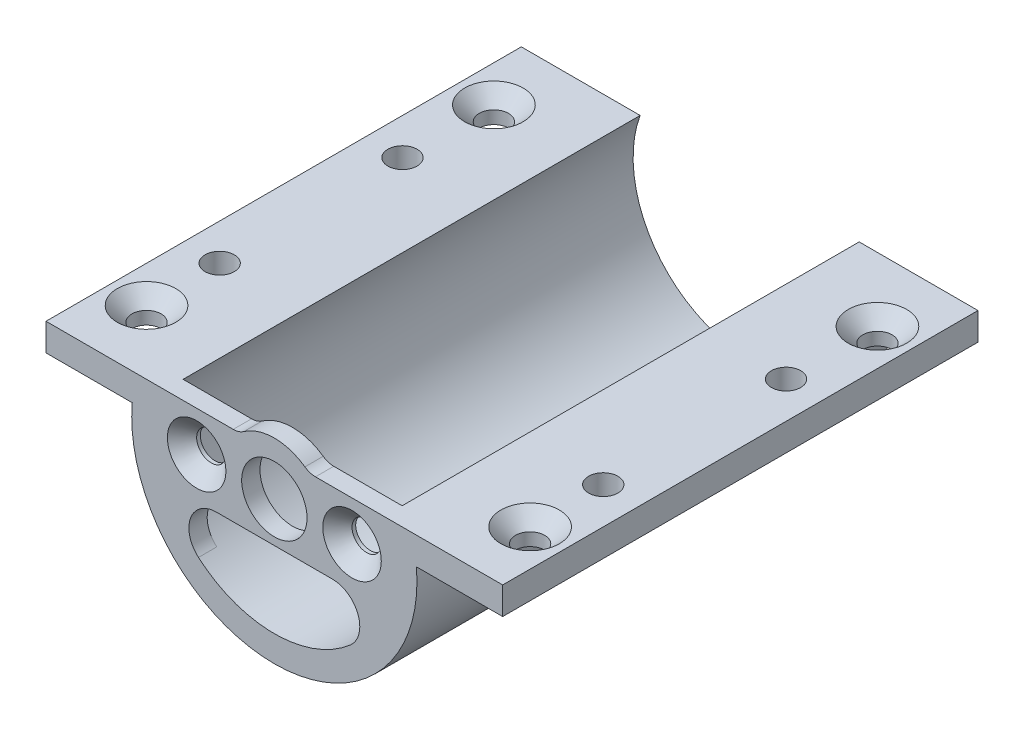
ISO-10303-21;
HEADER;
FILE_DESCRIPTION(('STEP AP214'),'2;1');
FILE_NAME('part.step','',(''),(''),'','','');
FILE_SCHEMA(('AUTOMOTIVE_DESIGN { 1 0 10303 214 1 1 1 1 }'));
ENDSEC;
DATA;
#1=APPLICATION_CONTEXT('core data for automotive mechanical design processes');
#2=APPLICATION_PROTOCOL_DEFINITION('international standard','automotive_design',2000,#1);
#3=PRODUCT_CONTEXT('',#1,'mechanical');
#4=PRODUCT('Part','Part','',(#3));
#5=PRODUCT_RELATED_PRODUCT_CATEGORY('part','',(#4));
#6=PRODUCT_DEFINITION_FORMATION('','',#4);
#7=PRODUCT_DEFINITION_CONTEXT('part definition',#1,'design');
#8=PRODUCT_DEFINITION('design','',#6,#7);
#9=PRODUCT_DEFINITION_SHAPE('','',#8);
#10=(LENGTH_UNIT() NAMED_UNIT(*) SI_UNIT(.MILLI.,.METRE.));
#11=(NAMED_UNIT(*) PLANE_ANGLE_UNIT() SI_UNIT($,.RADIAN.));
#12=(NAMED_UNIT(*) SI_UNIT($,.STERADIAN.) SOLID_ANGLE_UNIT());
#13=UNCERTAINTY_MEASURE_WITH_UNIT(LENGTH_MEASURE(1.E-05),#10,'distance_accuracy_value','');
#14=(GEOMETRIC_REPRESENTATION_CONTEXT(3) GLOBAL_UNCERTAINTY_ASSIGNED_CONTEXT((#13)) GLOBAL_UNIT_ASSIGNED_CONTEXT((#10,
#11,#12)) REPRESENTATION_CONTEXT('',''));
#15=CARTESIAN_POINT('',(0.,0.,0.));
#16=DIRECTION('',(0.,0.,1.));
#17=DIRECTION('',(1.,0.,0.));
#18=AXIS2_PLACEMENT_3D('',#15,#16,#17);
#19=CARTESIAN_POINT('',(0.,0.,-52.));
#20=DIRECTION('',(0.,0.,1.));
#21=DIRECTION('',(1.,0.,0.));
#22=AXIS2_PLACEMENT_3D('',#19,#20,#21);
#23=CYLINDRICAL_SURFACE('',#22,15.6028518383699);
#24=CARTESIAN_POINT('',(0.,0.,0.));
#25=DIRECTION('',(0.,0.,1.));
#26=DIRECTION('',(1.,0.,0.));
#27=AXIS2_PLACEMENT_3D('',#24,#25,#26);
#28=CIRCLE('',#27,15.6028518383699);
#29=CARTESIAN_POINT('',(15.5434013763655,1.36075682740229,0.));
#30=VERTEX_POINT('',#29);
#31=CARTESIAN_POINT('',(-15.5434013763655,1.36075682740228,0.));
#32=VERTEX_POINT('',#31);
#33=EDGE_CURVE('E305',#30,#32,#28,.F.);
#34=ORIENTED_EDGE('',*,*,#33,.T.);
#35=DIRECTION('',(0.,0.,1.));
#36=VECTOR('',#35,1.);
#37=CARTESIAN_POINT('',(-15.5434013763655,1.36075682740228,-52.));
#38=LINE('',#37,#36);
#39=CARTESIAN_POINT('',(-15.5434013763655,1.36075682740228,-52.));
#40=VERTEX_POINT('',#39);
#41=EDGE_CURVE('E211',#40,#32,#38,.T.);
#42=ORIENTED_EDGE('',*,*,#41,.F.);
#43=CARTESIAN_POINT('',(0.,0.,-52.));
#44=DIRECTION('',(0.,0.,1.));
#45=DIRECTION('',(1.,0.,0.));
#46=AXIS2_PLACEMENT_3D('',#43,#44,#45);
#47=CIRCLE('',#46,15.6028518383699);
#48=CARTESIAN_POINT('',(15.5434013763655,1.36075682740229,-52.));
#49=VERTEX_POINT('',#48);
#50=EDGE_CURVE('E323',#49,#40,#47,.F.);
#51=ORIENTED_EDGE('',*,*,#50,.F.);
#52=DIRECTION('',(0.,0.,1.));
#53=VECTOR('',#52,1.);
#54=CARTESIAN_POINT('',(15.5434013763655,1.36075682740229,-52.));
#55=LINE('',#54,#53);
#56=EDGE_CURVE('E202',#49,#30,#55,.T.);
#57=ORIENTED_EDGE('',*,*,#56,.T.);
#58=EDGE_LOOP('',(#34,#42,#51,#57));
#59=FACE_BOUND('',#58,.T.);
#60=ADVANCED_FACE('F42',(#59),#23,.T.);
#61=CARTESIAN_POINT('',(0.,1.36075682740228,-52.));
#62=DIRECTION('',(0.,-1.,0.));
#63=DIRECTION('',(0.,0.,-1.));
#64=AXIS2_PLACEMENT_3D('',#61,#62,#63);
#65=PLANE('',#64);
#66=CARTESIAN_POINT('',(-20.9810809150203,1.36075682740228,-7.00000000000003));
#67=DIRECTION('',(0.,-1.,0.));
#68=DIRECTION('',(0.,0.,-1.));
#69=AXIS2_PLACEMENT_3D('',#66,#67,#68);
#70=CIRCLE('',#69,1.60000000000001);
#71=CARTESIAN_POINT('',(-20.9810809150203,1.36075682740228,-8.60000000000003));
#72=VERTEX_POINT('',#71);
#73=EDGE_CURVE('E262',#72,#72,#70,.T.);
#74=ORIENTED_EDGE('',*,*,#73,.F.);
#75=EDGE_LOOP('',(#74));
#76=FACE_BOUND('',#75,.T.);
#77=CARTESIAN_POINT('',(-20.9810809150203,1.36075682740228,-45.));
#78=DIRECTION('',(0.,-1.,0.));
#79=DIRECTION('',(0.,0.,-1.));
#80=AXIS2_PLACEMENT_3D('',#77,#78,#79);
#81=CIRCLE('',#80,1.60000000000001);
#82=CARTESIAN_POINT('',(-20.9810809150203,1.36075682740228,-46.6));
#83=VERTEX_POINT('',#82);
#84=EDGE_CURVE('E256',#83,#83,#81,.T.);
#85=ORIENTED_EDGE('',*,*,#84,.F.);
#86=EDGE_LOOP('',(#85));
#87=FACE_BOUND('',#86,.T.);
#88=CARTESIAN_POINT('',(-20.9810809150203,1.36075682740228,-35.));
#89=DIRECTION('',(0.,-1.,0.));
#90=DIRECTION('',(0.,0.,-1.));
#91=AXIS2_PLACEMENT_3D('',#88,#89,#90);
#92=CIRCLE('',#91,1.60000000000001);
#93=CARTESIAN_POINT('',(-20.9810809150203,1.36075682740228,-36.6));
#94=VERTEX_POINT('',#93);
#95=EDGE_CURVE('E557',#94,#94,#92,.T.);
#96=ORIENTED_EDGE('',*,*,#95,.F.);
#97=EDGE_LOOP('',(#96));
#98=FACE_BOUND('',#97,.T.);
#99=CARTESIAN_POINT('',(-20.9810809150203,1.36075682740228,-15.));
#100=DIRECTION('',(0.,-1.,0.));
#101=DIRECTION('',(0.,0.,-1.));
#102=AXIS2_PLACEMENT_3D('',#99,#100,#101);
#103=CIRCLE('',#102,1.60000000000001);
#104=CARTESIAN_POINT('',(-20.9810809150203,1.36075682740228,-16.6));
#105=VERTEX_POINT('',#104);
#106=EDGE_CURVE('E565',#105,#105,#103,.T.);
#107=ORIENTED_EDGE('',*,*,#106,.F.);
#108=EDGE_LOOP('',(#107));
#109=FACE_BOUND('',#108,.T.);
#110=DIRECTION('',(1.,0.,0.));
#111=VECTOR('',#110,1.);
#112=CARTESIAN_POINT('',(0.,1.36075682740228,0.));
#113=LINE('',#112,#111);
#114=CARTESIAN_POINT('',(-24.9810809150203,1.36075682740228,0.));
#115=VERTEX_POINT('',#114);
#116=EDGE_CURVE('E327',#115,#32,#113,.T.);
#117=ORIENTED_EDGE('',*,*,#116,.F.);
#118=DIRECTION('',(0.,0.,1.));
#119=VECTOR('',#118,1.);
#120=CARTESIAN_POINT('',(-24.9810809150203,1.36075682740228,-52.));
#121=LINE('',#120,#119);
#122=CARTESIAN_POINT('',(-24.9810809150203,1.36075682740228,-52.));
#123=VERTEX_POINT('',#122);
#124=EDGE_CURVE('E367',#123,#115,#121,.T.);
#125=ORIENTED_EDGE('',*,*,#124,.F.);
#126=DIRECTION('',(1.,0.,0.));
#127=VECTOR('',#126,1.);
#128=CARTESIAN_POINT('',(0.,1.36075682740228,-52.));
#129=LINE('',#128,#127);
#130=EDGE_CURVE('E206',#123,#40,#129,.T.);
#131=ORIENTED_EDGE('',*,*,#130,.T.);
#132=ORIENTED_EDGE('',*,*,#41,.T.);
#133=EDGE_LOOP('',(#117,#125,#131,#132));
#134=FACE_BOUND('',#133,.T.);
#135=ADVANCED_FACE('F384',(#76,#87,#98,#109,#134),#65,.T.);
#136=CARTESIAN_POINT('',(-24.9810809150203,0.,-52.));
#137=DIRECTION('',(-1.,0.,0.));
#138=DIRECTION('',(0.,-1.,0.));
#139=AXIS2_PLACEMENT_3D('',#136,#137,#138);
#140=PLANE('',#139);
#141=DIRECTION('',(0.,-1.,0.));
#142=VECTOR('',#141,1.);
#143=CARTESIAN_POINT('',(-24.9810809150203,0.,0.));
#144=LINE('',#143,#142);
#145=CARTESIAN_POINT('',(-24.9810809150203,4.36075682740228,0.));
#146=VERTEX_POINT('',#145);
#147=EDGE_CURVE('E358',#146,#115,#144,.T.);
#148=ORIENTED_EDGE('',*,*,#147,.F.);
#149=DIRECTION('',(0.,0.,1.));
#150=VECTOR('',#149,1.);
#151=CARTESIAN_POINT('',(-24.9810809150203,4.36075682740228,-52.));
#152=LINE('',#151,#150);
#153=CARTESIAN_POINT('',(-24.9810809150203,4.36075682740228,-52.));
#154=VERTEX_POINT('',#153);
#155=EDGE_CURVE('E192',#154,#146,#152,.T.);
#156=ORIENTED_EDGE('',*,*,#155,.F.);
#157=DIRECTION('',(0.,-1.,0.));
#158=VECTOR('',#157,1.);
#159=CARTESIAN_POINT('',(-24.9810809150203,0.,-52.));
#160=LINE('',#159,#158);
#161=EDGE_CURVE('E342',#154,#123,#160,.T.);
#162=ORIENTED_EDGE('',*,*,#161,.T.);
#163=ORIENTED_EDGE('',*,*,#124,.T.);
#164=EDGE_LOOP('',(#148,#156,#162,#163));
#165=FACE_BOUND('',#164,.T.);
#166=ADVANCED_FACE('F379',(#165),#140,.T.);
#167=CARTESIAN_POINT('',(0.,4.36075682740229,-52.));
#168=DIRECTION('',(0.,1.,0.));
#169=DIRECTION('',(-1.,0.,0.));
#170=AXIS2_PLACEMENT_3D('',#167,#168,#169);
#171=PLANE('',#170);
#172=CARTESIAN_POINT('',(-20.9810809150203,4.36075682740228,-7.00000000000003));
#173=DIRECTION('',(0.,1.,0.));
#174=DIRECTION('',(0.,0.,1.));
#175=AXIS2_PLACEMENT_3D('',#172,#173,#174);
#176=CIRCLE('',#175,3.2);
#177=CARTESIAN_POINT('',(-20.9810809150203,4.36075682740228,-3.80000000000003));
#178=VERTEX_POINT('',#177);
#179=EDGE_CURVE('E530',#178,#178,#176,.T.);
#180=ORIENTED_EDGE('',*,*,#179,.F.);
#181=EDGE_LOOP('',(#180));
#182=FACE_BOUND('',#181,.T.);
#183=CARTESIAN_POINT('',(-20.9810809150203,4.36075682740228,-45.));
#184=DIRECTION('',(0.,1.,0.));
#185=DIRECTION('',(0.,0.,1.));
#186=AXIS2_PLACEMENT_3D('',#183,#184,#185);
#187=CIRCLE('',#186,3.2);
#188=CARTESIAN_POINT('',(-20.9810809150203,4.36075682740228,-41.8));
#189=VERTEX_POINT('',#188);
#190=EDGE_CURVE('E266',#189,#189,#187,.T.);
#191=ORIENTED_EDGE('',*,*,#190,.F.);
#192=EDGE_LOOP('',(#191));
#193=FACE_BOUND('',#192,.T.);
#194=CARTESIAN_POINT('',(-20.9810809150203,4.36075682740228,-35.));
#195=DIRECTION('',(0.,1.,0.));
#196=DIRECTION('',(0.,0.,1.));
#197=AXIS2_PLACEMENT_3D('',#194,#195,#196);
#198=CIRCLE('',#197,1.60000000000001);
#199=CARTESIAN_POINT('',(-20.9810809150203,4.36075682740228,-33.4));
#200=VERTEX_POINT('',#199);
#201=EDGE_CURVE('E248',#200,#200,#198,.T.);
#202=ORIENTED_EDGE('',*,*,#201,.F.);
#203=EDGE_LOOP('',(#202));
#204=FACE_BOUND('',#203,.T.);
#205=CARTESIAN_POINT('',(-20.9810809150203,4.36075682740228,-15.));
#206=DIRECTION('',(0.,1.,0.));
#207=DIRECTION('',(0.,0.,1.));
#208=AXIS2_PLACEMENT_3D('',#205,#206,#207);
#209=CIRCLE('',#208,1.60000000000001);
#210=CARTESIAN_POINT('',(-20.9810809150203,4.36075682740228,-13.4));
#211=VERTEX_POINT('',#210);
#212=EDGE_CURVE('E561',#211,#211,#209,.T.);
#213=ORIENTED_EDGE('',*,*,#212,.F.);
#214=EDGE_LOOP('',(#213));
#215=FACE_BOUND('',#214,.T.);
#216=DIRECTION('',(-1.,0.,0.));
#217=VECTOR('',#216,1.);
#218=CARTESIAN_POINT('',(0.,4.36075682740229,0.));
#219=LINE('',#218,#217);
#220=CARTESIAN_POINT('',(-4.49840452369252,4.36075682740229,0.));
#221=VERTEX_POINT('',#220);
#222=EDGE_CURVE('E298',#221,#146,#219,.T.);
#223=ORIENTED_EDGE('',*,*,#222,.F.);
#224=DIRECTION('',(0.,0.,-1.));
#225=VECTOR('',#224,1.);
#226=CARTESIAN_POINT('',(-4.49840452369252,4.36075682740229,-2.));
#227=LINE('',#226,#225);
#228=CARTESIAN_POINT('',(-4.49840452369252,4.36075682740228,-2.));
#229=VERTEX_POINT('',#228);
#230=EDGE_CURVE('E218',#221,#229,#227,.T.);
#231=ORIENTED_EDGE('',*,*,#230,.T.);
#232=DIRECTION('',(1.,0.,0.));
#233=VECTOR('',#232,1.);
#234=CARTESIAN_POINT('',(0.,4.36075682740228,-2.));
#235=LINE('',#234,#233);
#236=CARTESIAN_POINT('',(-11.9810809150203,4.36075682740228,-2.));
#237=VERTEX_POINT('',#236);
#238=EDGE_CURVE('E168',#237,#229,#235,.T.);
#239=ORIENTED_EDGE('',*,*,#238,.F.);
#240=DIRECTION('',(0.,0.,1.));
#241=VECTOR('',#240,1.);
#242=CARTESIAN_POINT('',(-11.9810809150203,4.36075682740228,-52.));
#243=LINE('',#242,#241);
#244=CARTESIAN_POINT('',(-11.9810809150203,4.36075682740228,-52.));
#245=VERTEX_POINT('',#244);
#246=EDGE_CURVE('E186',#245,#237,#243,.T.);
#247=ORIENTED_EDGE('',*,*,#246,.F.);
#248=DIRECTION('',(-1.,0.,0.));
#249=VECTOR('',#248,1.);
#250=CARTESIAN_POINT('',(0.,4.36075682740229,-52.));
#251=LINE('',#250,#249);
#252=EDGE_CURVE('E338',#245,#154,#251,.T.);
#253=ORIENTED_EDGE('',*,*,#252,.T.);
#254=ORIENTED_EDGE('',*,*,#155,.T.);
#255=EDGE_LOOP('',(#223,#231,#239,#247,#253,#254));
#256=FACE_BOUND('',#255,.T.);
#257=ADVANCED_FACE('F374',(#182,#193,#204,#215,#256),#171,.T.);
#258=CARTESIAN_POINT('',(0.,0.,-52.));
#259=DIRECTION('',(0.,0.,1.));
#260=DIRECTION('',(1.,0.,0.));
#261=AXIS2_PLACEMENT_3D('',#258,#259,#260);
#262=CYLINDRICAL_SURFACE('',#261,12.75);
#263=CARTESIAN_POINT('',(0.,0.,-2.));
#264=DIRECTION('',(0.,0.,1.));
#265=DIRECTION('',(1.,0.,0.));
#266=AXIS2_PLACEMENT_3D('',#263,#264,#265);
#267=CIRCLE('',#266,12.75);
#268=CARTESIAN_POINT('',(-8.30178654045703,-9.67692307692308,-2.));
#269=VERTEX_POINT('',#268);
#270=EDGE_CURVE('E180',#269,#237,#267,.F.);
#271=ORIENTED_EDGE('',*,*,#270,.F.);
#272=DIRECTION('',(0.,0.,1.));
#273=VECTOR('',#272,1.);
#274=CARTESIAN_POINT('',(-8.30178654045703,-9.67692307692308,-52.));
#275=LINE('',#274,#273);
#276=CARTESIAN_POINT('',(-8.30178654045703,-9.67692307692308,0.));
#277=VERTEX_POINT('',#276);
#278=EDGE_CURVE('E270',#269,#277,#275,.T.);
#279=ORIENTED_EDGE('',*,*,#278,.T.);
#280=CARTESIAN_POINT('',(0.,0.,0.));
#281=DIRECTION('',(0.,0.,1.));
#282=DIRECTION('',(1.,0.,0.));
#283=AXIS2_PLACEMENT_3D('',#280,#281,#282);
#284=CIRCLE('',#283,12.75);
#285=CARTESIAN_POINT('',(8.30178654045703,-9.67692307692308,0.));
#286=VERTEX_POINT('',#285);
#287=EDGE_CURVE('E292',#286,#277,#284,.F.);
#288=ORIENTED_EDGE('',*,*,#287,.F.);
#289=DIRECTION('',(0.,0.,1.));
#290=VECTOR('',#289,1.);
#291=CARTESIAN_POINT('',(8.30178654045703,-9.67692307692308,-52.));
#292=LINE('',#291,#290);
#293=CARTESIAN_POINT('',(8.30178654045703,-9.67692307692308,-2.));
#294=VERTEX_POINT('',#293);
#295=EDGE_CURVE('E176',#286,#294,#292,.F.);
#296=ORIENTED_EDGE('',*,*,#295,.T.);
#297=CARTESIAN_POINT('',(11.9810809150203,4.36075682740228,-2.));
#298=VERTEX_POINT('',#297);
#299=EDGE_CURVE('E156',#298,#294,#267,.F.);
#300=ORIENTED_EDGE('',*,*,#299,.F.);
#301=DIRECTION('',(0.,0.,1.));
#302=VECTOR('',#301,1.);
#303=CARTESIAN_POINT('',(11.9810809150203,4.36075682740228,-52.));
#304=LINE('',#303,#302);
#305=CARTESIAN_POINT('',(11.9810809150203,4.36075682740228,-52.));
#306=VERTEX_POINT('',#305);
#307=EDGE_CURVE('E172',#306,#298,#304,.T.);
#308=ORIENTED_EDGE('',*,*,#307,.F.);
#309=CARTESIAN_POINT('',(0.,0.,-52.));
#310=DIRECTION('',(0.,0.,1.));
#311=DIRECTION('',(1.,0.,0.));
#312=AXIS2_PLACEMENT_3D('',#309,#310,#311);
#313=CIRCLE('',#312,12.75);
#314=EDGE_CURVE('E335',#306,#245,#313,.F.);
#315=ORIENTED_EDGE('',*,*,#314,.T.);
#316=ORIENTED_EDGE('',*,*,#246,.T.);
#317=EDGE_LOOP('',(#271,#279,#288,#296,#300,#308,#315,#316));
#318=FACE_BOUND('',#317,.T.);
#319=ADVANCED_FACE('F170',(#318),#262,.F.);
#320=CARTESIAN_POINT('',(0.,4.36075682740228,-52.));
#321=DIRECTION('',(0.,-1.,0.));
#322=DIRECTION('',(1.,0.,0.));
#323=AXIS2_PLACEMENT_3D('',#320,#321,#322);
#324=PLANE('',#323);
#325=CARTESIAN_POINT('',(20.9810809150203,4.3607568274023,-45.));
#326=DIRECTION('',(0.,1.,0.));
#327=DIRECTION('',(0.,0.,1.));
#328=AXIS2_PLACEMENT_3D('',#325,#326,#327);
#329=CIRCLE('',#328,3.2);
#330=CARTESIAN_POINT('',(20.9810809150203,4.3607568274023,-41.8));
#331=VERTEX_POINT('',#330);
#332=EDGE_CURVE('E260',#331,#331,#329,.T.);
#333=ORIENTED_EDGE('',*,*,#332,.F.);
#334=EDGE_LOOP('',(#333));
#335=FACE_BOUND('',#334,.T.);
#336=CARTESIAN_POINT('',(20.9810809150203,4.3607568274023,-7.));
#337=DIRECTION('',(0.,1.,0.));
#338=DIRECTION('',(0.,0.,1.));
#339=AXIS2_PLACEMENT_3D('',#336,#337,#338);
#340=CIRCLE('',#339,3.2);
#341=CARTESIAN_POINT('',(20.9810809150203,4.3607568274023,-3.8));
#342=VERTEX_POINT('',#341);
#343=EDGE_CURVE('E254',#342,#342,#340,.T.);
#344=ORIENTED_EDGE('',*,*,#343,.F.);
#345=EDGE_LOOP('',(#344));
#346=FACE_BOUND('',#345,.T.);
#347=CARTESIAN_POINT('',(20.9810809150203,4.36075682740229,-15.));
#348=DIRECTION('',(0.,1.,0.));
#349=DIRECTION('',(0.,0.,1.));
#350=AXIS2_PLACEMENT_3D('',#347,#348,#349);
#351=CIRCLE('',#350,1.60000000000001);
#352=CARTESIAN_POINT('',(20.9810809150203,4.36075682740229,-13.4));
#353=VERTEX_POINT('',#352);
#354=EDGE_CURVE('E569',#353,#353,#351,.T.);
#355=ORIENTED_EDGE('',*,*,#354,.F.);
#356=EDGE_LOOP('',(#355));
#357=FACE_BOUND('',#356,.T.);
#358=CARTESIAN_POINT('',(20.9810809150203,4.36075682740229,-35.));
#359=DIRECTION('',(0.,1.,0.));
#360=DIRECTION('',(0.,0.,1.));
#361=AXIS2_PLACEMENT_3D('',#358,#359,#360);
#362=CIRCLE('',#361,1.60000000000001);
#363=CARTESIAN_POINT('',(20.9810809150203,4.36075682740229,-33.4));
#364=VERTEX_POINT('',#363);
#365=EDGE_CURVE('E577',#364,#364,#362,.T.);
#366=ORIENTED_EDGE('',*,*,#365,.F.);
#367=EDGE_LOOP('',(#366));
#368=FACE_BOUND('',#367,.T.);
#369=CARTESIAN_POINT('',(4.49840452369253,4.36075682740228,-2.));
#370=VERTEX_POINT('',#369);
#371=EDGE_CURVE('E153',#370,#298,#235,.T.);
#372=ORIENTED_EDGE('',*,*,#371,.F.);
#373=DIRECTION('',(0.,0.,1.));
#374=VECTOR('',#373,1.);
#375=CARTESIAN_POINT('',(4.49840452369253,4.36075682740228,-52.));
#376=LINE('',#375,#374);
#377=CARTESIAN_POINT('',(4.49840452369253,4.36075682740228,0.));
#378=VERTEX_POINT('',#377);
#379=EDGE_CURVE('E207',#370,#378,#376,.T.);
#380=ORIENTED_EDGE('',*,*,#379,.T.);
#381=DIRECTION('',(1.,0.,0.));
#382=VECTOR('',#381,1.);
#383=CARTESIAN_POINT('',(0.,4.36075682740228,0.));
#384=LINE('',#383,#382);
#385=CARTESIAN_POINT('',(24.9810809150203,4.36075682740229,0.));
#386=VERTEX_POINT('',#385);
#387=EDGE_CURVE('E299',#378,#386,#384,.T.);
#388=ORIENTED_EDGE('',*,*,#387,.T.);
#389=DIRECTION('',(0.,0.,1.));
#390=VECTOR('',#389,1.);
#391=CARTESIAN_POINT('',(24.9810809150203,4.36075682740229,-52.));
#392=LINE('',#391,#390);
#393=CARTESIAN_POINT('',(24.9810809150203,4.36075682740229,-52.));
#394=VERTEX_POINT('',#393);
#395=EDGE_CURVE('E187',#394,#386,#392,.T.);
#396=ORIENTED_EDGE('',*,*,#395,.F.);
#397=DIRECTION('',(1.,0.,0.));
#398=VECTOR('',#397,1.);
#399=CARTESIAN_POINT('',(0.,4.36075682740228,-52.));
#400=LINE('',#399,#398);
#401=EDGE_CURVE('E183',#306,#394,#400,.T.);
#402=ORIENTED_EDGE('',*,*,#401,.F.);
#403=ORIENTED_EDGE('',*,*,#307,.T.);
#404=EDGE_LOOP('',(#372,#380,#388,#396,#402,#403));
#405=FACE_BOUND('',#404,.T.);
#406=ADVANCED_FACE('F181',(#335,#346,#357,#368,#405),#324,.F.);
#407=CARTESIAN_POINT('',(24.9810809150203,0.,-52.));
#408=DIRECTION('',(-1.,0.,0.));
#409=DIRECTION('',(0.,0.,1.));
#410=AXIS2_PLACEMENT_3D('',#407,#408,#409);
#411=PLANE('',#410);
#412=DIRECTION('',(0.,-1.,0.));
#413=VECTOR('',#412,1.);
#414=CARTESIAN_POINT('',(24.9810809150203,0.,0.));
#415=LINE('',#414,#413);
#416=CARTESIAN_POINT('',(24.9810809150203,1.36075682740229,0.));
#417=VERTEX_POINT('',#416);
#418=EDGE_CURVE('E351',#386,#417,#415,.T.);
#419=ORIENTED_EDGE('',*,*,#418,.T.);
#420=DIRECTION('',(0.,0.,1.));
#421=VECTOR('',#420,1.);
#422=CARTESIAN_POINT('',(24.9810809150203,1.36075682740229,-52.));
#423=LINE('',#422,#421);
#424=CARTESIAN_POINT('',(24.9810809150203,1.36075682740229,-52.));
#425=VERTEX_POINT('',#424);
#426=EDGE_CURVE('E195',#425,#417,#423,.T.);
#427=ORIENTED_EDGE('',*,*,#426,.F.);
#428=DIRECTION('',(0.,-1.,0.));
#429=VECTOR('',#428,1.);
#430=CARTESIAN_POINT('',(24.9810809150203,0.,-52.));
#431=LINE('',#430,#429);
#432=EDGE_CURVE('E330',#394,#425,#431,.T.);
#433=ORIENTED_EDGE('',*,*,#432,.F.);
#434=ORIENTED_EDGE('',*,*,#395,.T.);
#435=EDGE_LOOP('',(#419,#427,#433,#434));
#436=FACE_BOUND('',#435,.T.);
#437=ADVANCED_FACE('F399',(#436),#411,.F.);
#438=CARTESIAN_POINT('',(0.,1.36075682740228,-52.));
#439=DIRECTION('',(0.,1.,0.));
#440=DIRECTION('',(-1.,0.,0.));
#441=AXIS2_PLACEMENT_3D('',#438,#439,#440);
#442=PLANE('',#441);
#443=CARTESIAN_POINT('',(20.9810809150203,1.36075682740229,-45.));
#444=DIRECTION('',(0.,1.,0.));
#445=DIRECTION('',(-1.,0.,0.));
#446=AXIS2_PLACEMENT_3D('',#443,#444,#445);
#447=CIRCLE('',#446,1.60000000000001);
#448=CARTESIAN_POINT('',(19.3810809150203,1.36075682740229,-45.));
#449=VERTEX_POINT('',#448);
#450=EDGE_CURVE('E250',#449,#449,#447,.T.);
#451=ORIENTED_EDGE('',*,*,#450,.T.);
#452=EDGE_LOOP('',(#451));
#453=FACE_BOUND('',#452,.T.);
#454=CARTESIAN_POINT('',(20.9810809150203,1.36075682740229,-7.));
#455=DIRECTION('',(0.,1.,0.));
#456=DIRECTION('',(-1.,0.,0.));
#457=AXIS2_PLACEMENT_3D('',#454,#455,#456);
#458=CIRCLE('',#457,1.60000000000001);
#459=CARTESIAN_POINT('',(19.3810809150203,1.36075682740229,-7.));
#460=VERTEX_POINT('',#459);
#461=EDGE_CURVE('E244',#460,#460,#458,.T.);
#462=ORIENTED_EDGE('',*,*,#461,.T.);
#463=EDGE_LOOP('',(#462));
#464=FACE_BOUND('',#463,.T.);
#465=CARTESIAN_POINT('',(20.9810809150203,1.36075682740229,-15.));
#466=DIRECTION('',(0.,1.,0.));
#467=DIRECTION('',(-1.,0.,0.));
#468=AXIS2_PLACEMENT_3D('',#465,#466,#467);
#469=CIRCLE('',#468,1.60000000000001);
#470=CARTESIAN_POINT('',(19.3810809150203,1.36075682740229,-15.));
#471=VERTEX_POINT('',#470);
#472=EDGE_CURVE('E573',#471,#471,#469,.T.);
#473=ORIENTED_EDGE('',*,*,#472,.T.);
#474=EDGE_LOOP('',(#473));
#475=FACE_BOUND('',#474,.T.);
#476=CARTESIAN_POINT('',(20.9810809150203,1.36075682740229,-35.));
#477=DIRECTION('',(0.,1.,0.));
#478=DIRECTION('',(-1.,0.,0.));
#479=AXIS2_PLACEMENT_3D('',#476,#477,#478);
#480=CIRCLE('',#479,1.60000000000001);
#481=CARTESIAN_POINT('',(19.3810809150203,1.36075682740229,-35.));
#482=VERTEX_POINT('',#481);
#483=EDGE_CURVE('E581',#482,#482,#480,.T.);
#484=ORIENTED_EDGE('',*,*,#483,.T.);
#485=EDGE_LOOP('',(#484));
#486=FACE_BOUND('',#485,.T.);
#487=DIRECTION('',(-1.,0.,0.));
#488=VECTOR('',#487,1.);
#489=CARTESIAN_POINT('',(0.,1.36075682740228,0.));
#490=LINE('',#489,#488);
#491=EDGE_CURVE('E310',#417,#30,#490,.T.);
#492=ORIENTED_EDGE('',*,*,#491,.T.);
#493=ORIENTED_EDGE('',*,*,#56,.F.);
#494=DIRECTION('',(-1.,0.,0.));
#495=VECTOR('',#494,1.);
#496=CARTESIAN_POINT('',(0.,1.36075682740228,-52.));
#497=LINE('',#496,#495);
#498=EDGE_CURVE('E326',#425,#49,#497,.T.);
#499=ORIENTED_EDGE('',*,*,#498,.F.);
#500=ORIENTED_EDGE('',*,*,#426,.T.);
#501=EDGE_LOOP('',(#492,#493,#499,#500));
#502=FACE_BOUND('',#501,.T.);
#503=ADVANCED_FACE('F394',(#453,#464,#475,#486,#502),#442,.F.);
#504=CARTESIAN_POINT('',(0.,0.,-52.));
#505=DIRECTION('',(0.,0.,1.));
#506=DIRECTION('',(1.,0.,0.));
#507=AXIS2_PLACEMENT_3D('',#504,#505,#506);
#508=PLANE('',#507);
#509=ORIENTED_EDGE('',*,*,#50,.T.);
#510=ORIENTED_EDGE('',*,*,#130,.F.);
#511=ORIENTED_EDGE('',*,*,#161,.F.);
#512=ORIENTED_EDGE('',*,*,#252,.F.);
#513=ORIENTED_EDGE('',*,*,#314,.F.);
#514=ORIENTED_EDGE('',*,*,#401,.T.);
#515=ORIENTED_EDGE('',*,*,#432,.T.);
#516=ORIENTED_EDGE('',*,*,#498,.T.);
#517=EDGE_LOOP('',(#509,#510,#511,#512,#513,#514,#515,#516));
#518=FACE_BOUND('',#517,.T.);
#519=ADVANCED_FACE('F431',(#518),#508,.F.);
#520=CARTESIAN_POINT('',(0.,0.,0.));
#521=DIRECTION('',(0.,0.,1.));
#522=DIRECTION('',(1.,0.,0.));
#523=AXIS2_PLACEMENT_3D('',#520,#521,#522);
#524=PLANE('',#523);
#525=CARTESIAN_POINT('',(-8.5,-0.0196215862988585,0.));
#526=DIRECTION('',(0.,0.,1.));
#527=DIRECTION('',(1.,0.,0.));
#528=AXIS2_PLACEMENT_3D('',#525,#526,#527);
#529=CIRCLE('',#528,3.2);
#530=CARTESIAN_POINT('',(-5.3,-0.0196215862988585,0.));
#531=VERTEX_POINT('',#530);
#532=EDGE_CURVE('E585',#531,#531,#529,.T.);
#533=ORIENTED_EDGE('',*,*,#532,.F.);
#534=EDGE_LOOP('',(#533));
#535=FACE_BOUND('',#534,.T.);
#536=CARTESIAN_POINT('',(8.5,-0.0196215862988585,0.));
#537=DIRECTION('',(0.,0.,1.));
#538=DIRECTION('',(1.,0.,0.));
#539=AXIS2_PLACEMENT_3D('',#536,#537,#538);
#540=CIRCLE('',#539,3.2);
#541=CARTESIAN_POINT('',(11.7,-0.0196215862988585,0.));
#542=VERTEX_POINT('',#541);
#543=EDGE_CURVE('E242',#542,#542,#540,.T.);
#544=ORIENTED_EDGE('',*,*,#543,.F.);
#545=EDGE_LOOP('',(#544));
#546=FACE_BOUND('',#545,.T.);
#547=ORIENTED_EDGE('',*,*,#287,.T.);
#548=CARTESIAN_POINT('',(-6.34842500152596,-7.4,0.));
#549=DIRECTION('',(0.,0.,1.));
#550=DIRECTION('',(1.,0.,0.));
#551=AXIS2_PLACEMENT_3D('',#548,#549,#550);
#552=CIRCLE('',#551,3.);
#553=CARTESIAN_POINT('',(-6.34842500152596,-4.4,0.));
#554=VERTEX_POINT('',#553);
#555=EDGE_CURVE('E280',#277,#554,#552,.F.);
#556=ORIENTED_EDGE('',*,*,#555,.T.);
#557=DIRECTION('',(1.,0.,0.));
#558=VECTOR('',#557,1.);
#559=CARTESIAN_POINT('',(0.,-4.4,0.));
#560=LINE('',#559,#558);
#561=CARTESIAN_POINT('',(6.34842500152596,-4.4,0.));
#562=VERTEX_POINT('',#561);
#563=EDGE_CURVE('E293',#554,#562,#560,.T.);
#564=ORIENTED_EDGE('',*,*,#563,.T.);
#565=CARTESIAN_POINT('',(6.34842500152596,-7.4,0.));
#566=DIRECTION('',(0.,0.,1.));
#567=DIRECTION('',(1.,0.,0.));
#568=AXIS2_PLACEMENT_3D('',#565,#566,#567);
#569=CIRCLE('',#568,3.);
#570=EDGE_CURVE('E51',#562,#286,#569,.F.);
#571=ORIENTED_EDGE('',*,*,#570,.T.);
#572=EDGE_LOOP('',(#547,#556,#564,#571));
#573=FACE_BOUND('',#572,.T.);
#574=ORIENTED_EDGE('',*,*,#33,.F.);
#575=ORIENTED_EDGE('',*,*,#491,.F.);
#576=ORIENTED_EDGE('',*,*,#418,.F.);
#577=ORIENTED_EDGE('',*,*,#387,.F.);
#578=CARTESIAN_POINT('',(4.49840452369253,6.36075682740228,0.));
#579=DIRECTION('',(0.,0.,1.));
#580=DIRECTION('',(1.,0.,0.));
#581=AXIS2_PLACEMENT_3D('',#578,#579,#580);
#582=CIRCLE('',#581,2.);
#583=CARTESIAN_POINT('',(3.34358928074461,4.72784477996827,0.));
#584=VERTEX_POINT('',#583);
#585=EDGE_CURVE('E221',#378,#584,#582,.F.);
#586=ORIENTED_EDGE('',*,*,#585,.T.);
#587=CARTESIAN_POINT('',(0.,0.,0.));
#588=DIRECTION('',(0.,0.,1.));
#589=DIRECTION('',(1.,0.,0.));
#590=AXIS2_PLACEMENT_3D('',#587,#588,#589);
#591=CIRCLE('',#590,5.79069128358467);
#592=CARTESIAN_POINT('',(-3.34358928074461,4.72784477996827,0.));
#593=VERTEX_POINT('',#592);
#594=EDGE_CURVE('E317',#584,#593,#591,.T.);
#595=ORIENTED_EDGE('',*,*,#594,.T.);
#596=CARTESIAN_POINT('',(-4.49840452369252,6.36075682740228,0.));
#597=DIRECTION('',(0.,0.,1.));
#598=DIRECTION('',(1.,0.,0.));
#599=AXIS2_PLACEMENT_3D('',#596,#597,#598);
#600=CIRCLE('',#599,2.);
#601=EDGE_CURVE('E226',#593,#221,#600,.F.);
#602=ORIENTED_EDGE('',*,*,#601,.T.);
#603=ORIENTED_EDGE('',*,*,#222,.T.);
#604=ORIENTED_EDGE('',*,*,#147,.T.);
#605=ORIENTED_EDGE('',*,*,#116,.T.);
#606=EDGE_LOOP('',(#574,#575,#576,#577,#586,#595,#602,#603,#604,#605));
#607=FACE_BOUND('',#606,.T.);
#608=CARTESIAN_POINT('',(0.,0.,0.));
#609=DIRECTION('',(0.,0.,1.));
#610=DIRECTION('',(1.,0.,0.));
#611=AXIS2_PLACEMENT_3D('',#608,#609,#610);
#612=CIRCLE('',#611,3.575);
#613=CARTESIAN_POINT('',(3.575,0.,0.));
#614=VERTEX_POINT('',#613);
#615=EDGE_CURVE('E236',#614,#614,#612,.T.);
#616=ORIENTED_EDGE('',*,*,#615,.F.);
#617=EDGE_LOOP('',(#616));
#618=FACE_BOUND('',#617,.T.);
#619=ADVANCED_FACE('F290',(#535,#546,#573,#607,#618),#524,.T.);
#620=CARTESIAN_POINT('',(0.,-4.4,-2.));
#621=DIRECTION('',(0.,-1.,0.));
#622=DIRECTION('',(0.,0.,-1.));
#623=AXIS2_PLACEMENT_3D('',#620,#621,#622);
#624=PLANE('',#623);
#625=ORIENTED_EDGE('',*,*,#563,.F.);
#626=DIRECTION('',(0.,0.,-1.));
#627=VECTOR('',#626,1.);
#628=CARTESIAN_POINT('',(-6.34842500152596,-4.4,-2.00000000000002));
#629=LINE('',#628,#627);
#630=CARTESIAN_POINT('',(-6.34842500152596,-4.4,-2.));
#631=VERTEX_POINT('',#630);
#632=EDGE_CURVE('E63',#554,#631,#629,.T.);
#633=ORIENTED_EDGE('',*,*,#632,.T.);
#634=DIRECTION('',(1.,0.,0.));
#635=VECTOR('',#634,1.);
#636=CARTESIAN_POINT('',(0.,-4.4,-2.));
#637=LINE('',#636,#635);
#638=CARTESIAN_POINT('',(6.34842500152596,-4.4,-2.));
#639=VERTEX_POINT('',#638);
#640=EDGE_CURVE('E302',#631,#639,#637,.T.);
#641=ORIENTED_EDGE('',*,*,#640,.T.);
#642=DIRECTION('',(0.,0.,-1.));
#643=VECTOR('',#642,1.);
#644=CARTESIAN_POINT('',(6.34842500152596,-4.4,0.));
#645=LINE('',#644,#643);
#646=EDGE_CURVE('E274',#639,#562,#645,.F.);
#647=ORIENTED_EDGE('',*,*,#646,.T.);
#648=EDGE_LOOP('',(#625,#633,#641,#647));
#649=FACE_BOUND('',#648,.T.);
#650=ADVANCED_FACE('F301',(#649),#624,.T.);
#651=CARTESIAN_POINT('',(0.,0.,-2.));
#652=DIRECTION('',(0.,0.,1.));
#653=DIRECTION('',(1.,0.,0.));
#654=AXIS2_PLACEMENT_3D('',#651,#652,#653);
#655=CYLINDRICAL_SURFACE('',#654,5.79069128358467);
#656=ORIENTED_EDGE('',*,*,#594,.F.);
#657=DIRECTION('',(0.,0.,1.));
#658=VECTOR('',#657,1.);
#659=CARTESIAN_POINT('',(3.34358928074461,4.72784477996827,-2.));
#660=LINE('',#659,#658);
#661=CARTESIAN_POINT('',(3.34358928074461,4.72784477996827,-2.));
#662=VERTEX_POINT('',#661);
#663=EDGE_CURVE('E215',#584,#662,#660,.F.);
#664=ORIENTED_EDGE('',*,*,#663,.T.);
#665=CARTESIAN_POINT('',(0.,0.,-2.));
#666=DIRECTION('',(0.,0.,1.));
#667=DIRECTION('',(1.,0.,0.));
#668=AXIS2_PLACEMENT_3D('',#665,#666,#667);
#669=CIRCLE('',#668,5.79069128358467);
#670=CARTESIAN_POINT('',(-3.34358928074461,4.72784477996827,-2.));
#671=VERTEX_POINT('',#670);
#672=EDGE_CURVE('E166',#662,#671,#669,.T.);
#673=ORIENTED_EDGE('',*,*,#672,.T.);
#674=DIRECTION('',(0.,0.,1.));
#675=VECTOR('',#674,1.);
#676=CARTESIAN_POINT('',(-3.34358928074461,4.72784477996827,-2.));
#677=LINE('',#676,#675);
#678=EDGE_CURVE('E210',#671,#593,#677,.T.);
#679=ORIENTED_EDGE('',*,*,#678,.T.);
#680=EDGE_LOOP('',(#656,#664,#673,#679));
#681=FACE_BOUND('',#680,.T.);
#682=ADVANCED_FACE('F404',(#681),#655,.T.);
#683=CARTESIAN_POINT('',(0.,0.,-2.));
#684=DIRECTION('',(0.,0.,1.));
#685=DIRECTION('',(1.,0.,0.));
#686=AXIS2_PLACEMENT_3D('',#683,#684,#685);
#687=CYLINDRICAL_SURFACE('',#686,3.575);
#688=CARTESIAN_POINT('',(0.,0.,-2.));
#689=DIRECTION('',(0.,0.,1.));
#690=DIRECTION('',(1.,0.,0.));
#691=AXIS2_PLACEMENT_3D('',#688,#689,#690);
#692=CIRCLE('',#691,3.575);
#693=CARTESIAN_POINT('',(3.575,0.,-2.));
#694=VERTEX_POINT('',#693);
#695=EDGE_CURVE('E178',#694,#694,#692,.T.);
#696=ORIENTED_EDGE('',*,*,#695,.F.);
#697=EDGE_LOOP('',(#696));
#698=FACE_BOUND('',#697,.T.);
#699=ORIENTED_EDGE('',*,*,#615,.T.);
#700=EDGE_LOOP('',(#699));
#701=FACE_BOUND('',#700,.T.);
#702=ADVANCED_FACE('F418',(#698,#701),#687,.F.);
#703=CARTESIAN_POINT('',(0.,0.,-2.));
#704=DIRECTION('',(0.,0.,1.));
#705=DIRECTION('',(1.,0.,0.));
#706=AXIS2_PLACEMENT_3D('',#703,#704,#705);
#707=PLANE('',#706);
#708=CARTESIAN_POINT('',(-8.5,-0.0196215862988585,-2.));
#709=DIRECTION('',(0.,0.,1.));
#710=DIRECTION('',(1.,0.,0.));
#711=AXIS2_PLACEMENT_3D('',#708,#709,#710);
#712=CIRCLE('',#711,1.6);
#713=CARTESIAN_POINT('',(-6.9,-0.0196215862988585,-2.));
#714=VERTEX_POINT('',#713);
#715=EDGE_CURVE('E238',#714,#714,#712,.T.);
#716=ORIENTED_EDGE('',*,*,#715,.T.);
#717=EDGE_LOOP('',(#716));
#718=FACE_BOUND('',#717,.T.);
#719=CARTESIAN_POINT('',(8.5,-0.0196215862988585,-2.));
#720=DIRECTION('',(0.,0.,1.));
#721=DIRECTION('',(1.,0.,0.));
#722=AXIS2_PLACEMENT_3D('',#719,#720,#721);
#723=CIRCLE('',#722,1.6);
#724=CARTESIAN_POINT('',(10.1,-0.0196215862988585,-2.));
#725=VERTEX_POINT('',#724);
#726=EDGE_CURVE('E232',#725,#725,#723,.T.);
#727=ORIENTED_EDGE('',*,*,#726,.T.);
#728=EDGE_LOOP('',(#727));
#729=FACE_BOUND('',#728,.T.);
#730=ORIENTED_EDGE('',*,*,#695,.T.);
#731=EDGE_LOOP('',(#730));
#732=FACE_BOUND('',#731,.T.);
#733=ORIENTED_EDGE('',*,*,#299,.T.);
#734=CARTESIAN_POINT('',(6.34842500152596,-7.4,-2.));
#735=DIRECTION('',(0.,0.,1.));
#736=DIRECTION('',(1.,0.,0.));
#737=AXIS2_PLACEMENT_3D('',#734,#735,#736);
#738=CIRCLE('',#737,3.);
#739=EDGE_CURVE('E12',#294,#639,#738,.T.);
#740=ORIENTED_EDGE('',*,*,#739,.T.);
#741=ORIENTED_EDGE('',*,*,#640,.F.);
#742=CARTESIAN_POINT('',(-6.34842500152596,-7.4,-2.));
#743=DIRECTION('',(0.,0.,1.));
#744=DIRECTION('',(1.,0.,0.));
#745=AXIS2_PLACEMENT_3D('',#742,#743,#744);
#746=CIRCLE('',#745,3.);
#747=EDGE_CURVE('E283',#631,#269,#746,.T.);
#748=ORIENTED_EDGE('',*,*,#747,.T.);
#749=ORIENTED_EDGE('',*,*,#270,.T.);
#750=ORIENTED_EDGE('',*,*,#238,.T.);
#751=CARTESIAN_POINT('',(-4.49840452369252,6.36075682740228,-2.));
#752=DIRECTION('',(0.,0.,1.));
#753=DIRECTION('',(1.,0.,0.));
#754=AXIS2_PLACEMENT_3D('',#751,#752,#753);
#755=CIRCLE('',#754,2.);
#756=EDGE_CURVE('E229',#229,#671,#755,.T.);
#757=ORIENTED_EDGE('',*,*,#756,.T.);
#758=ORIENTED_EDGE('',*,*,#672,.F.);
#759=CARTESIAN_POINT('',(4.49840452369253,6.36075682740228,-2.));
#760=DIRECTION('',(0.,0.,1.));
#761=DIRECTION('',(1.,0.,0.));
#762=AXIS2_PLACEMENT_3D('',#759,#760,#761);
#763=CIRCLE('',#762,2.);
#764=EDGE_CURVE('E160',#662,#370,#763,.T.);
#765=ORIENTED_EDGE('',*,*,#764,.T.);
#766=ORIENTED_EDGE('',*,*,#371,.T.);
#767=EDGE_LOOP('',(#733,#740,#741,#748,#749,#750,#757,#758,#765,#766));
#768=FACE_BOUND('',#767,.T.);
#769=ADVANCED_FACE('F155',(#718,#729,#732,#768),#707,.F.);
#770=CARTESIAN_POINT('',(4.49840452369253,6.36075682740228,-2.));
#771=DIRECTION('',(0.,0.,1.));
#772=DIRECTION('',(1.,0.,0.));
#773=AXIS2_PLACEMENT_3D('',#770,#771,#772);
#774=CYLINDRICAL_SURFACE('',#773,2.);
#775=ORIENTED_EDGE('',*,*,#764,.F.);
#776=ORIENTED_EDGE('',*,*,#663,.F.);
#777=ORIENTED_EDGE('',*,*,#585,.F.);
#778=ORIENTED_EDGE('',*,*,#379,.F.);
#779=EDGE_LOOP('',(#775,#776,#777,#778));
#780=FACE_BOUND('',#779,.T.);
#781=ADVANCED_FACE('F407',(#780),#774,.F.);
#782=CARTESIAN_POINT('',(-4.49840452369252,6.36075682740228,-2.));
#783=DIRECTION('',(0.,0.,1.));
#784=DIRECTION('',(1.,0.,0.));
#785=AXIS2_PLACEMENT_3D('',#782,#783,#784);
#786=CYLINDRICAL_SURFACE('',#785,2.);
#787=ORIENTED_EDGE('',*,*,#756,.F.);
#788=ORIENTED_EDGE('',*,*,#230,.F.);
#789=ORIENTED_EDGE('',*,*,#601,.F.);
#790=ORIENTED_EDGE('',*,*,#678,.F.);
#791=EDGE_LOOP('',(#787,#788,#789,#790));
#792=FACE_BOUND('',#791,.T.);
#793=ADVANCED_FACE('F409',(#792),#786,.F.);
#794=CARTESIAN_POINT('',(8.5,-0.0196215862988585,0.));
#795=DIRECTION('',(0.,0.,1.));
#796=DIRECTION('',(1.,0.,0.));
#797=AXIS2_PLACEMENT_3D('',#794,#795,#796);
#798=CYLINDRICAL_SURFACE('',#797,1.6);
#799=CARTESIAN_POINT('',(8.5,-0.0196215862988585,-1.59999999999999));
#800=DIRECTION('',(0.,0.,1.));
#801=DIRECTION('',(1.,0.,0.));
#802=AXIS2_PLACEMENT_3D('',#799,#800,#801);
#803=CIRCLE('',#802,1.6);
#804=CARTESIAN_POINT('',(10.1,-0.0196215862988585,-1.59999999999999));
#805=VERTEX_POINT('',#804);
#806=EDGE_CURVE('E237',#805,#805,#803,.T.);
#807=ORIENTED_EDGE('',*,*,#806,.T.);
#808=EDGE_LOOP('',(#807));
#809=FACE_BOUND('',#808,.T.);
#810=ORIENTED_EDGE('',*,*,#726,.F.);
#811=EDGE_LOOP('',(#810));
#812=FACE_BOUND('',#811,.T.);
#813=ADVANCED_FACE('F415',(#809,#812),#798,.F.);
#814=CARTESIAN_POINT('',(8.5,-0.0196215862988585,0.));
#815=DIRECTION('',(0.,0.,1.));
#816=DIRECTION('',(1.,0.,0.));
#817=AXIS2_PLACEMENT_3D('',#814,#815,#816);
#818=CONICAL_SURFACE('',#817,3.2,0.78539816339745);
#819=ORIENTED_EDGE('',*,*,#806,.F.);
#820=EDGE_LOOP('',(#819));
#821=FACE_BOUND('',#820,.T.);
#822=ORIENTED_EDGE('',*,*,#543,.T.);
#823=EDGE_LOOP('',(#822));
#824=FACE_BOUND('',#823,.T.);
#825=ADVANCED_FACE('F460',(#821,#824),#818,.F.);
#826=CARTESIAN_POINT('',(-8.5,-0.0196215862988585,0.));
#827=DIRECTION('',(0.,0.,1.));
#828=DIRECTION('',(1.,0.,0.));
#829=AXIS2_PLACEMENT_3D('',#826,#827,#828);
#830=CYLINDRICAL_SURFACE('',#829,1.6);
#831=CARTESIAN_POINT('',(-8.5,-0.0196215862988585,-1.59999999999999));
#832=DIRECTION('',(0.,0.,1.));
#833=DIRECTION('',(1.,0.,0.));
#834=AXIS2_PLACEMENT_3D('',#831,#832,#833);
#835=CIRCLE('',#834,1.6);
#836=CARTESIAN_POINT('',(-6.9,-0.0196215862988585,-1.59999999999999));
#837=VERTEX_POINT('',#836);
#838=EDGE_CURVE('E243',#837,#837,#835,.T.);
#839=ORIENTED_EDGE('',*,*,#838,.T.);
#840=EDGE_LOOP('',(#839));
#841=FACE_BOUND('',#840,.T.);
#842=ORIENTED_EDGE('',*,*,#715,.F.);
#843=EDGE_LOOP('',(#842));
#844=FACE_BOUND('',#843,.T.);
#845=ADVANCED_FACE('F464',(#841,#844),#830,.F.);
#846=CARTESIAN_POINT('',(-8.5,-0.0196215862988585,0.));
#847=DIRECTION('',(0.,0.,1.));
#848=DIRECTION('',(1.,0.,0.));
#849=AXIS2_PLACEMENT_3D('',#846,#847,#848);
#850=CONICAL_SURFACE('',#849,3.2,0.78539816339745);
#851=ORIENTED_EDGE('',*,*,#838,.F.);
#852=EDGE_LOOP('',(#851));
#853=FACE_BOUND('',#852,.T.);
#854=ORIENTED_EDGE('',*,*,#532,.T.);
#855=EDGE_LOOP('',(#854));
#856=FACE_BOUND('',#855,.T.);
#857=ADVANCED_FACE('F468',(#853,#856),#850,.F.);
#858=CARTESIAN_POINT('',(20.9810809150203,4.36075682740229,-35.));
#859=DIRECTION('',(0.,1.,0.));
#860=DIRECTION('',(0.,0.,1.));
#861=AXIS2_PLACEMENT_3D('',#858,#859,#860);
#862=CYLINDRICAL_SURFACE('',#861,1.60000000000001);
#863=ORIENTED_EDGE('',*,*,#365,.T.);
#864=EDGE_LOOP('',(#863));
#865=FACE_BOUND('',#864,.T.);
#866=ORIENTED_EDGE('',*,*,#483,.F.);
#867=EDGE_LOOP('',(#866));
#868=FACE_BOUND('',#867,.T.);
#869=ADVANCED_FACE('F472',(#865,#868),#862,.F.);
#870=CARTESIAN_POINT('',(20.9810809150203,4.36075682740229,-15.));
#871=DIRECTION('',(0.,1.,0.));
#872=DIRECTION('',(0.,0.,1.));
#873=AXIS2_PLACEMENT_3D('',#870,#871,#872);
#874=CYLINDRICAL_SURFACE('',#873,1.60000000000001);
#875=ORIENTED_EDGE('',*,*,#354,.T.);
#876=EDGE_LOOP('',(#875));
#877=FACE_BOUND('',#876,.T.);
#878=ORIENTED_EDGE('',*,*,#472,.F.);
#879=EDGE_LOOP('',(#878));
#880=FACE_BOUND('',#879,.T.);
#881=ADVANCED_FACE('F476',(#877,#880),#874,.F.);
#882=CARTESIAN_POINT('',(-20.9810809150203,4.36075682740228,-15.));
#883=DIRECTION('',(0.,1.,0.));
#884=DIRECTION('',(0.,0.,1.));
#885=AXIS2_PLACEMENT_3D('',#882,#883,#884);
#886=CYLINDRICAL_SURFACE('',#885,1.60000000000001);
#887=ORIENTED_EDGE('',*,*,#106,.T.);
#888=EDGE_LOOP('',(#887));
#889=FACE_BOUND('',#888,.T.);
#890=ORIENTED_EDGE('',*,*,#212,.T.);
#891=EDGE_LOOP('',(#890));
#892=FACE_BOUND('',#891,.T.);
#893=ADVANCED_FACE('F480',(#889,#892),#886,.F.);
#894=CARTESIAN_POINT('',(-20.9810809150203,4.36075682740228,-35.));
#895=DIRECTION('',(0.,1.,0.));
#896=DIRECTION('',(0.,0.,1.));
#897=AXIS2_PLACEMENT_3D('',#894,#895,#896);
#898=CYLINDRICAL_SURFACE('',#897,1.60000000000001);
#899=ORIENTED_EDGE('',*,*,#95,.T.);
#900=EDGE_LOOP('',(#899));
#901=FACE_BOUND('',#900,.T.);
#902=ORIENTED_EDGE('',*,*,#201,.T.);
#903=EDGE_LOOP('',(#902));
#904=FACE_BOUND('',#903,.T.);
#905=ADVANCED_FACE('F484',(#901,#904),#898,.F.);
#906=CARTESIAN_POINT('',(20.9810809150203,4.36075682740229,-7.));
#907=DIRECTION('',(0.,1.,0.));
#908=DIRECTION('',(0.,0.,1.));
#909=AXIS2_PLACEMENT_3D('',#906,#907,#908);
#910=CYLINDRICAL_SURFACE('',#909,1.60000000000001);
#911=CARTESIAN_POINT('',(20.9810809150203,2.76075682740232,-7.));
#912=DIRECTION('',(0.,1.,0.));
#913=DIRECTION('',(0.,0.,1.));
#914=AXIS2_PLACEMENT_3D('',#911,#912,#913);
#915=CIRCLE('',#914,1.60000000000001);
#916=CARTESIAN_POINT('',(20.9810809150203,2.76075682740232,-5.39999999999999));
#917=VERTEX_POINT('',#916);
#918=EDGE_CURVE('E249',#917,#917,#915,.T.);
#919=ORIENTED_EDGE('',*,*,#918,.T.);
#920=EDGE_LOOP('',(#919));
#921=FACE_BOUND('',#920,.T.);
#922=ORIENTED_EDGE('',*,*,#461,.F.);
#923=EDGE_LOOP('',(#922));
#924=FACE_BOUND('',#923,.T.);
#925=ADVANCED_FACE('F488',(#921,#924),#910,.F.);
#926=CARTESIAN_POINT('',(20.9810809150203,4.3607568274023,-7.));
#927=DIRECTION('',(0.,1.,0.));
#928=DIRECTION('',(0.,0.,1.));
#929=AXIS2_PLACEMENT_3D('',#926,#927,#928);
#930=CONICAL_SURFACE('',#929,3.2,0.785398163397452);
#931=ORIENTED_EDGE('',*,*,#918,.F.);
#932=EDGE_LOOP('',(#931));
#933=FACE_BOUND('',#932,.T.);
#934=ORIENTED_EDGE('',*,*,#343,.T.);
#935=EDGE_LOOP('',(#934));
#936=FACE_BOUND('',#935,.T.);
#937=ADVANCED_FACE('F492',(#933,#936),#930,.F.);
#938=CARTESIAN_POINT('',(20.9810809150203,4.36075682740229,-45.));
#939=DIRECTION('',(0.,1.,0.));
#940=DIRECTION('',(0.,0.,1.));
#941=AXIS2_PLACEMENT_3D('',#938,#939,#940);
#942=CYLINDRICAL_SURFACE('',#941,1.60000000000001);
#943=CARTESIAN_POINT('',(20.9810809150203,2.76075682740232,-45.));
#944=DIRECTION('',(0.,1.,0.));
#945=DIRECTION('',(0.,0.,1.));
#946=AXIS2_PLACEMENT_3D('',#943,#944,#945);
#947=CIRCLE('',#946,1.60000000000001);
#948=CARTESIAN_POINT('',(20.9810809150203,2.76075682740232,-43.4));
#949=VERTEX_POINT('',#948);
#950=EDGE_CURVE('E255',#949,#949,#947,.T.);
#951=ORIENTED_EDGE('',*,*,#950,.T.);
#952=EDGE_LOOP('',(#951));
#953=FACE_BOUND('',#952,.T.);
#954=ORIENTED_EDGE('',*,*,#450,.F.);
#955=EDGE_LOOP('',(#954));
#956=FACE_BOUND('',#955,.T.);
#957=ADVANCED_FACE('F496',(#953,#956),#942,.F.);
#958=CARTESIAN_POINT('',(20.9810809150203,4.3607568274023,-45.));
#959=DIRECTION('',(0.,1.,0.));
#960=DIRECTION('',(0.,0.,1.));
#961=AXIS2_PLACEMENT_3D('',#958,#959,#960);
#962=CONICAL_SURFACE('',#961,3.2,0.785398163397452);
#963=ORIENTED_EDGE('',*,*,#950,.F.);
#964=EDGE_LOOP('',(#963));
#965=FACE_BOUND('',#964,.T.);
#966=ORIENTED_EDGE('',*,*,#332,.T.);
#967=EDGE_LOOP('',(#966));
#968=FACE_BOUND('',#967,.T.);
#969=ADVANCED_FACE('F500',(#965,#968),#962,.F.);
#970=CARTESIAN_POINT('',(-20.9810809150203,4.36075682740228,-45.));
#971=DIRECTION('',(0.,1.,0.));
#972=DIRECTION('',(0.,0.,1.));
#973=AXIS2_PLACEMENT_3D('',#970,#971,#972);
#974=CYLINDRICAL_SURFACE('',#973,1.60000000000001);
#975=ORIENTED_EDGE('',*,*,#84,.T.);
#976=EDGE_LOOP('',(#975));
#977=FACE_BOUND('',#976,.T.);
#978=CARTESIAN_POINT('',(-20.9810809150203,2.76075682740231,-45.));
#979=DIRECTION('',(0.,1.,0.));
#980=DIRECTION('',(0.,0.,1.));
#981=AXIS2_PLACEMENT_3D('',#978,#979,#980);
#982=CIRCLE('',#981,1.60000000000001);
#983=CARTESIAN_POINT('',(-20.9810809150203,2.76075682740231,-43.4));
#984=VERTEX_POINT('',#983);
#985=EDGE_CURVE('E261',#984,#984,#982,.T.);
#986=ORIENTED_EDGE('',*,*,#985,.T.);
#987=EDGE_LOOP('',(#986));
#988=FACE_BOUND('',#987,.T.);
#989=ADVANCED_FACE('F504',(#977,#988),#974,.F.);
#990=CARTESIAN_POINT('',(-20.9810809150203,4.36075682740228,-45.));
#991=DIRECTION('',(0.,1.,0.));
#992=DIRECTION('',(0.,0.,1.));
#993=AXIS2_PLACEMENT_3D('',#990,#991,#992);
#994=CONICAL_SURFACE('',#993,3.2,0.785398163397452);
#995=ORIENTED_EDGE('',*,*,#985,.F.);
#996=EDGE_LOOP('',(#995));
#997=FACE_BOUND('',#996,.T.);
#998=ORIENTED_EDGE('',*,*,#190,.T.);
#999=EDGE_LOOP('',(#998));
#1000=FACE_BOUND('',#999,.T.);
#1001=ADVANCED_FACE('F508',(#997,#1000),#994,.F.);
#1002=CARTESIAN_POINT('',(-20.9810809150203,4.36075682740228,-7.00000000000003));
#1003=DIRECTION('',(0.,1.,0.));
#1004=DIRECTION('',(0.,0.,1.));
#1005=AXIS2_PLACEMENT_3D('',#1002,#1003,#1004);
#1006=CYLINDRICAL_SURFACE('',#1005,1.60000000000001);
#1007=ORIENTED_EDGE('',*,*,#73,.T.);
#1008=EDGE_LOOP('',(#1007));
#1009=FACE_BOUND('',#1008,.T.);
#1010=CARTESIAN_POINT('',(-20.9810809150203,2.76075682740231,-7.00000000000003));
#1011=DIRECTION('',(0.,1.,0.));
#1012=DIRECTION('',(0.,0.,1.));
#1013=AXIS2_PLACEMENT_3D('',#1010,#1011,#1012);
#1014=CIRCLE('',#1013,1.60000000000001);
#1015=CARTESIAN_POINT('',(-20.9810809150203,2.76075682740231,-5.40000000000002));
#1016=VERTEX_POINT('',#1015);
#1017=EDGE_CURVE('E267',#1016,#1016,#1014,.T.);
#1018=ORIENTED_EDGE('',*,*,#1017,.T.);
#1019=EDGE_LOOP('',(#1018));
#1020=FACE_BOUND('',#1019,.T.);
#1021=ADVANCED_FACE('F512',(#1009,#1020),#1006,.F.);
#1022=CARTESIAN_POINT('',(-20.9810809150203,4.36075682740228,-7.00000000000003));
#1023=DIRECTION('',(0.,1.,0.));
#1024=DIRECTION('',(0.,0.,1.));
#1025=AXIS2_PLACEMENT_3D('',#1022,#1023,#1024);
#1026=CONICAL_SURFACE('',#1025,3.2,0.785398163397452);
#1027=ORIENTED_EDGE('',*,*,#1017,.F.);
#1028=EDGE_LOOP('',(#1027));
#1029=FACE_BOUND('',#1028,.T.);
#1030=ORIENTED_EDGE('',*,*,#179,.T.);
#1031=EDGE_LOOP('',(#1030));
#1032=FACE_BOUND('',#1031,.T.);
#1033=ADVANCED_FACE('F516',(#1029,#1032),#1026,.F.);
#1034=CARTESIAN_POINT('',(-6.34842500152596,-7.4,-52.));
#1035=DIRECTION('',(0.,0.,1.));
#1036=DIRECTION('',(1.,0.,0.));
#1037=AXIS2_PLACEMENT_3D('',#1034,#1035,#1036);
#1038=CYLINDRICAL_SURFACE('',#1037,3.);
#1039=ORIENTED_EDGE('',*,*,#747,.F.);
#1040=ORIENTED_EDGE('',*,*,#632,.F.);
#1041=ORIENTED_EDGE('',*,*,#555,.F.);
#1042=ORIENTED_EDGE('',*,*,#278,.F.);
#1043=EDGE_LOOP('',(#1039,#1040,#1041,#1042));
#1044=FACE_BOUND('',#1043,.T.);
#1045=ADVANCED_FACE('F519',(#1044),#1038,.F.);
#1046=CARTESIAN_POINT('',(6.34842500152596,-7.4,-52.));
#1047=DIRECTION('',(0.,0.,1.));
#1048=DIRECTION('',(1.,0.,0.));
#1049=AXIS2_PLACEMENT_3D('',#1046,#1047,#1048);
#1050=CYLINDRICAL_SURFACE('',#1049,3.);
#1051=ORIENTED_EDGE('',*,*,#739,.F.);
#1052=ORIENTED_EDGE('',*,*,#295,.F.);
#1053=ORIENTED_EDGE('',*,*,#570,.F.);
#1054=ORIENTED_EDGE('',*,*,#646,.F.);
#1055=EDGE_LOOP('',(#1051,#1052,#1053,#1054));
#1056=FACE_BOUND('',#1055,.T.);
#1057=ADVANCED_FACE('F44',(#1056),#1050,.F.);
#1058=CLOSED_SHELL('',(#60,#135,#166,#257,#319,#406,#437,#503,#519,#619,#650,#682,#702,#769,
#781,#793,#813,#825,#845,#857,#869,#881,#893,#905,#925,#937,#957,#969,#989,#1001,#1021,#1033,
#1045,#1057));
#1059=MANIFOLD_SOLID_BREP('B2',#1058);
#1060=ADVANCED_BREP_SHAPE_REPRESENTATION('',(#18,#1059),#14);
#1061=SHAPE_DEFINITION_REPRESENTATION(#9,#1060);
ENDSEC;
END-ISO-10303-21;
